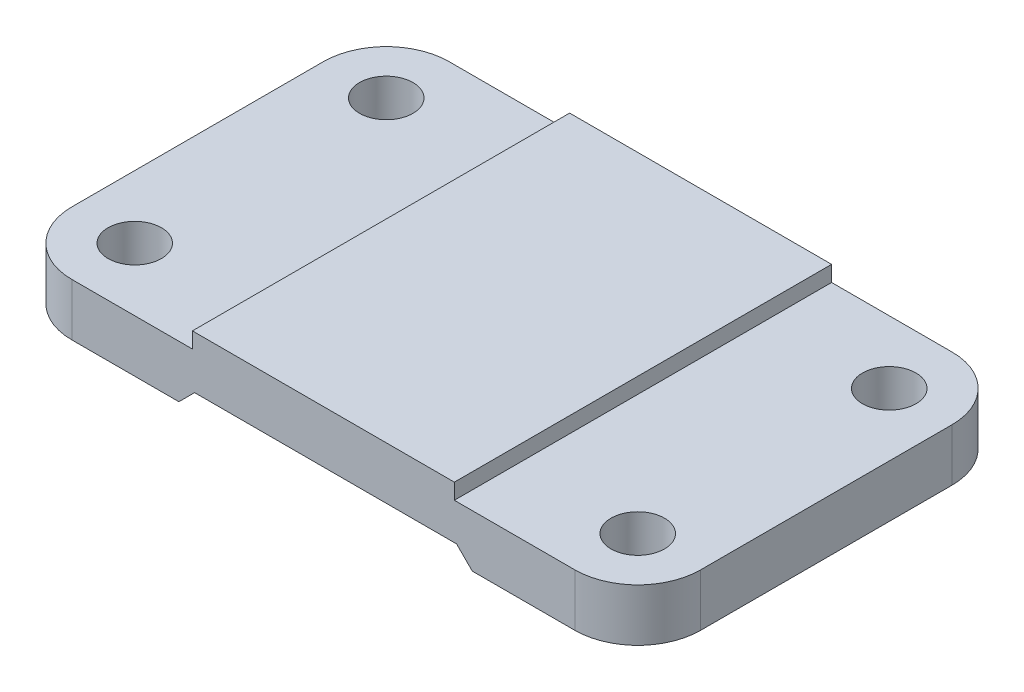
ISO-10303-21;
HEADER;
FILE_DESCRIPTION(('STEP AP214'),'2;1');
FILE_NAME('part.step','',(''),(''),'','','');
FILE_SCHEMA(('AUTOMOTIVE_DESIGN { 1 0 10303 214 1 1 1 1 }'));
ENDSEC;
DATA;
#1=APPLICATION_CONTEXT('core data for automotive mechanical design processes');
#2=APPLICATION_PROTOCOL_DEFINITION('international standard','automotive_design',2000,#1);
#3=PRODUCT_CONTEXT('',#1,'mechanical');
#4=PRODUCT('Part','Part','',(#3));
#5=PRODUCT_RELATED_PRODUCT_CATEGORY('part','',(#4));
#6=PRODUCT_DEFINITION_FORMATION('','',#4);
#7=PRODUCT_DEFINITION_CONTEXT('part definition',#1,'design');
#8=PRODUCT_DEFINITION('design','',#6,#7);
#9=PRODUCT_DEFINITION_SHAPE('','',#8);
#10=(LENGTH_UNIT() NAMED_UNIT(*) SI_UNIT(.MILLI.,.METRE.));
#11=(NAMED_UNIT(*) PLANE_ANGLE_UNIT() SI_UNIT($,.RADIAN.));
#12=(NAMED_UNIT(*) SI_UNIT($,.STERADIAN.) SOLID_ANGLE_UNIT());
#13=UNCERTAINTY_MEASURE_WITH_UNIT(LENGTH_MEASURE(1.E-05),#10,'distance_accuracy_value','');
#14=(GEOMETRIC_REPRESENTATION_CONTEXT(3) GLOBAL_UNCERTAINTY_ASSIGNED_CONTEXT((#13)) GLOBAL_UNIT_ASSIGNED_CONTEXT((#10,
#11,#12)) REPRESENTATION_CONTEXT('',''));
#15=CARTESIAN_POINT('',(0.,0.,0.));
#16=DIRECTION('',(0.,0.,1.));
#17=DIRECTION('',(1.,0.,0.));
#18=AXIS2_PLACEMENT_3D('',#15,#16,#17);
#19=CARTESIAN_POINT('',(32.4207275710564,0.,72.));
#20=DIRECTION('',(0.,1.,0.));
#21=DIRECTION('',(-1.,0.,0.));
#22=AXIS2_PLACEMENT_3D('',#19,#20,#21);
#23=PLANE('',#22);
#24=CARTESIAN_POINT('',(12.,0.,60.));
#25=DIRECTION('',(0.,1.,0.));
#26=DIRECTION('',(-1.,0.,0.));
#27=AXIS2_PLACEMENT_3D('',#24,#25,#26);
#28=CIRCLE('',#27,5.1);
#29=CARTESIAN_POINT('',(6.9,0.,60.));
#30=VERTEX_POINT('',#29);
#31=EDGE_CURVE('E308',#30,#30,#28,.F.);
#32=ORIENTED_EDGE('',*,*,#31,.F.);
#33=EDGE_LOOP('',(#32));
#34=FACE_BOUND('',#33,.T.);
#35=CARTESIAN_POINT('',(12.,0.,12.));
#36=DIRECTION('',(0.,1.,0.));
#37=DIRECTION('',(-1.,0.,0.));
#38=AXIS2_PLACEMENT_3D('',#35,#36,#37);
#39=CIRCLE('',#38,5.1);
#40=CARTESIAN_POINT('',(6.9,0.,12.));
#41=VERTEX_POINT('',#40);
#42=EDGE_CURVE('E305',#41,#41,#39,.F.);
#43=ORIENTED_EDGE('',*,*,#42,.F.);
#44=EDGE_LOOP('',(#43));
#45=FACE_BOUND('',#44,.T.);
#46=DIRECTION('',(0.,0.,-1.));
#47=VECTOR('',#46,1.);
#48=CARTESIAN_POINT('',(0.,0.,72.));
#49=LINE('',#48,#47);
#50=CARTESIAN_POINT('',(0.,0.,60.));
#51=VERTEX_POINT('',#50);
#52=CARTESIAN_POINT('',(0.,0.,12.));
#53=VERTEX_POINT('',#52);
#54=EDGE_CURVE('E257',#51,#53,#49,.T.);
#55=ORIENTED_EDGE('',*,*,#54,.T.);
#56=CARTESIAN_POINT('',(12.,0.,12.));
#57=DIRECTION('',(0.,1.,0.));
#58=DIRECTION('',(-1.,0.,0.));
#59=AXIS2_PLACEMENT_3D('',#56,#57,#58);
#60=CIRCLE('',#59,12.);
#61=CARTESIAN_POINT('',(12.,0.,0.));
#62=VERTEX_POINT('',#61);
#63=EDGE_CURVE('E195',#53,#62,#60,.F.);
#64=ORIENTED_EDGE('',*,*,#63,.T.);
#65=DIRECTION('',(1.,0.,0.));
#66=VECTOR('',#65,1.);
#67=CARTESIAN_POINT('',(32.4207275710564,0.,0.));
#68=LINE('',#67,#66);
#69=CARTESIAN_POINT('',(32.4207275710564,0.,0.));
#70=VERTEX_POINT('',#69);
#71=EDGE_CURVE('E181',#62,#70,#68,.T.);
#72=ORIENTED_EDGE('',*,*,#71,.T.);
#73=DIRECTION('',(0.,0.,-1.));
#74=VECTOR('',#73,1.);
#75=CARTESIAN_POINT('',(32.4207275710564,0.,72.));
#76=LINE('',#75,#74);
#77=CARTESIAN_POINT('',(32.4207275710564,0.,72.));
#78=VERTEX_POINT('',#77);
#79=EDGE_CURVE('E173',#78,#70,#76,.T.);
#80=ORIENTED_EDGE('',*,*,#79,.F.);
#81=DIRECTION('',(1.,0.,0.));
#82=VECTOR('',#81,1.);
#83=CARTESIAN_POINT('',(32.4207275710564,0.,72.));
#84=LINE('',#83,#82);
#85=CARTESIAN_POINT('',(12.,0.,72.));
#86=VERTEX_POINT('',#85);
#87=EDGE_CURVE('E159',#86,#78,#84,.T.);
#88=ORIENTED_EDGE('',*,*,#87,.F.);
#89=CARTESIAN_POINT('',(12.,0.,60.));
#90=DIRECTION('',(0.,1.,0.));
#91=DIRECTION('',(-1.,0.,0.));
#92=AXIS2_PLACEMENT_3D('',#89,#90,#91);
#93=CIRCLE('',#92,12.);
#94=EDGE_CURVE('E193',#86,#51,#93,.F.);
#95=ORIENTED_EDGE('',*,*,#94,.T.);
#96=EDGE_LOOP('',(#55,#64,#72,#80,#88,#95));
#97=FACE_BOUND('',#96,.T.);
#98=ADVANCED_FACE('F44',(#34,#45,#97),#23,.F.);
#99=CARTESIAN_POINT('',(35.4207275710564,2.99999999999999,72.));
#100=DIRECTION('',(-0.707106781186547,0.707106781186548,0.));
#101=DIRECTION('',(-0.707106781186548,-0.707106781186547,0.));
#102=AXIS2_PLACEMENT_3D('',#99,#100,#101);
#103=PLANE('',#102);
#104=DIRECTION('',(0.707106781186548,0.707106781186547,0.));
#105=VECTOR('',#104,1.);
#106=CARTESIAN_POINT('',(35.4207275710564,2.99999999999999,0.));
#107=LINE('',#106,#105);
#108=CARTESIAN_POINT('',(35.4207275710564,2.99999999999999,0.));
#109=VERTEX_POINT('',#108);
#110=EDGE_CURVE('E286',#70,#109,#107,.T.);
#111=ORIENTED_EDGE('',*,*,#110,.T.);
#112=DIRECTION('',(0.,0.,-1.));
#113=VECTOR('',#112,1.);
#114=CARTESIAN_POINT('',(35.4207275710564,2.99999999999999,72.));
#115=LINE('',#114,#113);
#116=CARTESIAN_POINT('',(35.4207275710564,2.99999999999999,72.));
#117=VERTEX_POINT('',#116);
#118=EDGE_CURVE('E175',#117,#109,#115,.T.);
#119=ORIENTED_EDGE('',*,*,#118,.F.);
#120=DIRECTION('',(0.707106781186548,0.707106781186547,0.));
#121=VECTOR('',#120,1.);
#122=CARTESIAN_POINT('',(35.4207275710564,2.99999999999999,72.));
#123=LINE('',#122,#121);
#124=EDGE_CURVE('E162',#78,#117,#123,.T.);
#125=ORIENTED_EDGE('',*,*,#124,.F.);
#126=ORIENTED_EDGE('',*,*,#79,.T.);
#127=EDGE_LOOP('',(#111,#119,#125,#126));
#128=FACE_BOUND('',#127,.T.);
#129=ADVANCED_FACE('F172',(#128),#103,.F.);
#130=CARTESIAN_POINT('',(85.4207275710564,3.,72.));
#131=DIRECTION('',(0.,1.,0.));
#132=DIRECTION('',(-1.,0.,0.));
#133=AXIS2_PLACEMENT_3D('',#130,#131,#132);
#134=PLANE('',#133);
#135=DIRECTION('',(1.,0.,0.));
#136=VECTOR('',#135,1.);
#137=CARTESIAN_POINT('',(85.4207275710564,3.,0.));
#138=LINE('',#137,#136);
#139=CARTESIAN_POINT('',(85.4207275710564,3.,0.));
#140=VERTEX_POINT('',#139);
#141=EDGE_CURVE('E285',#109,#140,#138,.T.);
#142=ORIENTED_EDGE('',*,*,#141,.T.);
#143=DIRECTION('',(0.,0.,-1.));
#144=VECTOR('',#143,1.);
#145=CARTESIAN_POINT('',(85.4207275710564,3.,72.));
#146=LINE('',#145,#144);
#147=CARTESIAN_POINT('',(85.4207275710564,3.,72.));
#148=VERTEX_POINT('',#147);
#149=EDGE_CURVE('E187',#148,#140,#146,.T.);
#150=ORIENTED_EDGE('',*,*,#149,.F.);
#151=DIRECTION('',(1.,0.,0.));
#152=VECTOR('',#151,1.);
#153=CARTESIAN_POINT('',(85.4207275710564,3.,72.));
#154=LINE('',#153,#152);
#155=EDGE_CURVE('E177',#117,#148,#154,.T.);
#156=ORIENTED_EDGE('',*,*,#155,.F.);
#157=ORIENTED_EDGE('',*,*,#118,.T.);
#158=EDGE_LOOP('',(#142,#150,#156,#157));
#159=FACE_BOUND('',#158,.T.);
#160=ADVANCED_FACE('F389',(#159),#134,.F.);
#161=CARTESIAN_POINT('',(88.4207275710564,0.,72.));
#162=DIRECTION('',(0.707106781186547,0.707106781186548,0.));
#163=DIRECTION('',(-0.707106781186548,0.707106781186547,0.));
#164=AXIS2_PLACEMENT_3D('',#161,#162,#163);
#165=PLANE('',#164);
#166=DIRECTION('',(0.707106781186548,-0.707106781186547,0.));
#167=VECTOR('',#166,1.);
#168=CARTESIAN_POINT('',(88.4207275710564,0.,0.));
#169=LINE('',#168,#167);
#170=CARTESIAN_POINT('',(88.4207275710564,0.,0.));
#171=VERTEX_POINT('',#170);
#172=EDGE_CURVE('E248',#140,#171,#169,.T.);
#173=ORIENTED_EDGE('',*,*,#172,.T.);
#174=DIRECTION('',(0.,0.,-1.));
#175=VECTOR('',#174,1.);
#176=CARTESIAN_POINT('',(88.4207275710564,0.,72.));
#177=LINE('',#176,#175);
#178=CARTESIAN_POINT('',(88.4207275710564,0.,72.));
#179=VERTEX_POINT('',#178);
#180=EDGE_CURVE('E230',#179,#171,#177,.T.);
#181=ORIENTED_EDGE('',*,*,#180,.F.);
#182=DIRECTION('',(0.707106781186548,-0.707106781186547,0.));
#183=VECTOR('',#182,1.);
#184=CARTESIAN_POINT('',(88.4207275710564,0.,72.));
#185=LINE('',#184,#183);
#186=EDGE_CURVE('E282',#148,#179,#185,.T.);
#187=ORIENTED_EDGE('',*,*,#186,.F.);
#188=ORIENTED_EDGE('',*,*,#149,.T.);
#189=EDGE_LOOP('',(#173,#181,#187,#188));
#190=FACE_BOUND('',#189,.T.);
#191=ADVANCED_FACE('F280',(#190),#165,.F.);
#192=CARTESIAN_POINT('',(120.,0.,72.));
#193=DIRECTION('',(0.,1.,0.));
#194=DIRECTION('',(-1.,0.,0.));
#195=AXIS2_PLACEMENT_3D('',#192,#193,#194);
#196=PLANE('',#195);
#197=CARTESIAN_POINT('',(108.,0.,12.));
#198=DIRECTION('',(0.,1.,0.));
#199=DIRECTION('',(-1.,0.,0.));
#200=AXIS2_PLACEMENT_3D('',#197,#198,#199);
#201=CIRCLE('',#200,5.09999999999998);
#202=CARTESIAN_POINT('',(102.9,0.,12.));
#203=VERTEX_POINT('',#202);
#204=EDGE_CURVE('E314',#203,#203,#201,.F.);
#205=ORIENTED_EDGE('',*,*,#204,.F.);
#206=EDGE_LOOP('',(#205));
#207=FACE_BOUND('',#206,.T.);
#208=CARTESIAN_POINT('',(108.,0.,60.));
#209=DIRECTION('',(0.,1.,0.));
#210=DIRECTION('',(-1.,0.,0.));
#211=AXIS2_PLACEMENT_3D('',#208,#209,#210);
#212=CIRCLE('',#211,5.09999999999998);
#213=CARTESIAN_POINT('',(102.9,0.,60.));
#214=VERTEX_POINT('',#213);
#215=EDGE_CURVE('E320',#214,#214,#212,.F.);
#216=ORIENTED_EDGE('',*,*,#215,.F.);
#217=EDGE_LOOP('',(#216));
#218=FACE_BOUND('',#217,.T.);
#219=DIRECTION('',(1.,0.,0.));
#220=VECTOR('',#219,1.);
#221=CARTESIAN_POINT('',(120.,0.,0.));
#222=LINE('',#221,#220);
#223=CARTESIAN_POINT('',(108.,0.,0.));
#224=VERTEX_POINT('',#223);
#225=EDGE_CURVE('E222',#171,#224,#222,.T.);
#226=ORIENTED_EDGE('',*,*,#225,.T.);
#227=CARTESIAN_POINT('',(108.,0.,12.));
#228=DIRECTION('',(0.,1.,0.));
#229=DIRECTION('',(-1.,0.,0.));
#230=AXIS2_PLACEMENT_3D('',#227,#228,#229);
#231=CIRCLE('',#230,12.);
#232=CARTESIAN_POINT('',(120.,0.,12.));
#233=VERTEX_POINT('',#232);
#234=EDGE_CURVE('E214',#224,#233,#231,.F.);
#235=ORIENTED_EDGE('',*,*,#234,.T.);
#236=DIRECTION('',(0.,0.,-1.));
#237=VECTOR('',#236,1.);
#238=CARTESIAN_POINT('',(120.,0.,72.));
#239=LINE('',#238,#237);
#240=CARTESIAN_POINT('',(120.,0.,60.));
#241=VERTEX_POINT('',#240);
#242=EDGE_CURVE('E219',#241,#233,#239,.T.);
#243=ORIENTED_EDGE('',*,*,#242,.F.);
#244=CARTESIAN_POINT('',(108.,0.,60.));
#245=DIRECTION('',(0.,1.,0.));
#246=DIRECTION('',(-1.,0.,0.));
#247=AXIS2_PLACEMENT_3D('',#244,#245,#246);
#248=CIRCLE('',#247,12.);
#249=CARTESIAN_POINT('',(108.,0.,72.));
#250=VERTEX_POINT('',#249);
#251=EDGE_CURVE('E59',#241,#250,#248,.F.);
#252=ORIENTED_EDGE('',*,*,#251,.T.);
#253=DIRECTION('',(1.,0.,0.));
#254=VECTOR('',#253,1.);
#255=CARTESIAN_POINT('',(120.,0.,72.));
#256=LINE('',#255,#254);
#257=EDGE_CURVE('E301',#179,#250,#256,.T.);
#258=ORIENTED_EDGE('',*,*,#257,.F.);
#259=ORIENTED_EDGE('',*,*,#180,.T.);
#260=EDGE_LOOP('',(#226,#235,#243,#252,#258,#259));
#261=FACE_BOUND('',#260,.T.);
#262=ADVANCED_FACE('F218',(#207,#218,#261),#196,.F.);
#263=CARTESIAN_POINT('',(120.,10.,72.));
#264=DIRECTION('',(-1.,0.,0.));
#265=DIRECTION('',(0.,0.,1.));
#266=AXIS2_PLACEMENT_3D('',#263,#264,#265);
#267=PLANE('',#266);
#268=ORIENTED_EDGE('',*,*,#242,.T.);
#269=DIRECTION('',(0.,1.,0.));
#270=VECTOR('',#269,1.);
#271=CARTESIAN_POINT('',(120.,10.,12.));
#272=LINE('',#271,#270);
#273=CARTESIAN_POINT('',(120.,10.,12.));
#274=VERTEX_POINT('',#273);
#275=EDGE_CURVE('E207',#233,#274,#272,.T.);
#276=ORIENTED_EDGE('',*,*,#275,.T.);
#277=DIRECTION('',(0.,0.,-1.));
#278=VECTOR('',#277,1.);
#279=CARTESIAN_POINT('',(120.,10.,72.));
#280=LINE('',#279,#278);
#281=CARTESIAN_POINT('',(120.,10.,60.));
#282=VERTEX_POINT('',#281);
#283=EDGE_CURVE('E231',#282,#274,#280,.T.);
#284=ORIENTED_EDGE('',*,*,#283,.F.);
#285=DIRECTION('',(0.,1.,0.));
#286=VECTOR('',#285,1.);
#287=CARTESIAN_POINT('',(120.,10.,60.));
#288=LINE('',#287,#286);
#289=EDGE_CURVE('E205',#282,#241,#288,.F.);
#290=ORIENTED_EDGE('',*,*,#289,.T.);
#291=EDGE_LOOP('',(#268,#276,#284,#290));
#292=FACE_BOUND('',#291,.T.);
#293=ADVANCED_FACE('F227',(#292),#267,.F.);
#294=CARTESIAN_POINT('',(85.,10.,72.));
#295=DIRECTION('',(0.,-1.,0.));
#296=DIRECTION('',(0.,0.,-1.));
#297=AXIS2_PLACEMENT_3D('',#294,#295,#296);
#298=PLANE('',#297);
#299=CARTESIAN_POINT('',(108.,10.,12.));
#300=DIRECTION('',(0.,1.,0.));
#301=DIRECTION('',(0.,0.,-1.));
#302=AXIS2_PLACEMENT_3D('',#299,#300,#301);
#303=CIRCLE('',#302,5.09999999999998);
#304=CARTESIAN_POINT('',(108.,10.,6.90000000000005));
#305=VERTEX_POINT('',#304);
#306=EDGE_CURVE('E311',#305,#305,#303,.T.);
#307=ORIENTED_EDGE('',*,*,#306,.F.);
#308=EDGE_LOOP('',(#307));
#309=FACE_BOUND('',#308,.T.);
#310=CARTESIAN_POINT('',(108.,10.,60.));
#311=DIRECTION('',(0.,1.,0.));
#312=DIRECTION('',(0.,0.,1.));
#313=AXIS2_PLACEMENT_3D('',#310,#311,#312);
#314=CIRCLE('',#313,5.09999999999998);
#315=CARTESIAN_POINT('',(108.,10.,65.1));
#316=VERTEX_POINT('',#315);
#317=EDGE_CURVE('E317',#316,#316,#314,.T.);
#318=ORIENTED_EDGE('',*,*,#317,.F.);
#319=EDGE_LOOP('',(#318));
#320=FACE_BOUND('',#319,.T.);
#321=ORIENTED_EDGE('',*,*,#283,.T.);
#322=CARTESIAN_POINT('',(108.,10.,12.));
#323=DIRECTION('',(0.,-1.,0.));
#324=DIRECTION('',(0.,0.,-1.));
#325=AXIS2_PLACEMENT_3D('',#322,#323,#324);
#326=CIRCLE('',#325,12.);
#327=CARTESIAN_POINT('',(108.,10.,0.));
#328=VERTEX_POINT('',#327);
#329=EDGE_CURVE('E211',#274,#328,#326,.F.);
#330=ORIENTED_EDGE('',*,*,#329,.T.);
#331=DIRECTION('',(-1.,0.,0.));
#332=VECTOR('',#331,1.);
#333=CARTESIAN_POINT('',(85.,10.,0.));
#334=LINE('',#333,#332);
#335=CARTESIAN_POINT('',(85.,10.,0.));
#336=VERTEX_POINT('',#335);
#337=EDGE_CURVE('E238',#328,#336,#334,.T.);
#338=ORIENTED_EDGE('',*,*,#337,.T.);
#339=DIRECTION('',(0.,0.,-1.));
#340=VECTOR('',#339,1.);
#341=CARTESIAN_POINT('',(85.,10.,72.));
#342=LINE('',#341,#340);
#343=CARTESIAN_POINT('',(85.,10.,72.));
#344=VERTEX_POINT('',#343);
#345=EDGE_CURVE('E272',#344,#336,#342,.T.);
#346=ORIENTED_EDGE('',*,*,#345,.F.);
#347=DIRECTION('',(-1.,0.,0.));
#348=VECTOR('',#347,1.);
#349=CARTESIAN_POINT('',(85.,10.,72.));
#350=LINE('',#349,#348);
#351=CARTESIAN_POINT('',(108.,10.,72.));
#352=VERTEX_POINT('',#351);
#353=EDGE_CURVE('E299',#352,#344,#350,.T.);
#354=ORIENTED_EDGE('',*,*,#353,.F.);
#355=CARTESIAN_POINT('',(108.,10.,60.));
#356=DIRECTION('',(0.,-1.,0.));
#357=DIRECTION('',(0.,0.,-1.));
#358=AXIS2_PLACEMENT_3D('',#355,#356,#357);
#359=CIRCLE('',#358,12.);
#360=EDGE_CURVE('E67',#352,#282,#359,.F.);
#361=ORIENTED_EDGE('',*,*,#360,.T.);
#362=EDGE_LOOP('',(#321,#330,#338,#346,#354,#361));
#363=FACE_BOUND('',#362,.T.);
#364=ADVANCED_FACE('F236',(#309,#320,#363),#298,.F.);
#365=CARTESIAN_POINT('',(85.,13.,72.));
#366=DIRECTION('',(-1.,0.,0.));
#367=DIRECTION('',(0.,0.,1.));
#368=AXIS2_PLACEMENT_3D('',#365,#366,#367);
#369=PLANE('',#368);
#370=DIRECTION('',(0.,1.,0.));
#371=VECTOR('',#370,1.);
#372=CARTESIAN_POINT('',(85.,13.,0.));
#373=LINE('',#372,#371);
#374=CARTESIAN_POINT('',(85.,13.,0.));
#375=VERTEX_POINT('',#374);
#376=EDGE_CURVE('E244',#336,#375,#373,.T.);
#377=ORIENTED_EDGE('',*,*,#376,.T.);
#378=DIRECTION('',(0.,0.,-1.));
#379=VECTOR('',#378,1.);
#380=CARTESIAN_POINT('',(85.,13.,72.));
#381=LINE('',#380,#379);
#382=CARTESIAN_POINT('',(85.,13.,72.));
#383=VERTEX_POINT('',#382);
#384=EDGE_CURVE('E269',#383,#375,#381,.T.);
#385=ORIENTED_EDGE('',*,*,#384,.F.);
#386=DIRECTION('',(0.,1.,0.));
#387=VECTOR('',#386,1.);
#388=CARTESIAN_POINT('',(85.,13.,72.));
#389=LINE('',#388,#387);
#390=EDGE_CURVE('E297',#344,#383,#389,.T.);
#391=ORIENTED_EDGE('',*,*,#390,.F.);
#392=ORIENTED_EDGE('',*,*,#345,.T.);
#393=EDGE_LOOP('',(#377,#385,#391,#392));
#394=FACE_BOUND('',#393,.T.);
#395=ADVANCED_FACE('F374',(#394),#369,.F.);
#396=CARTESIAN_POINT('',(35.,13.,72.));
#397=DIRECTION('',(0.,-1.,0.));
#398=DIRECTION('',(0.,0.,-1.));
#399=AXIS2_PLACEMENT_3D('',#396,#397,#398);
#400=PLANE('',#399);
#401=DIRECTION('',(-1.,0.,0.));
#402=VECTOR('',#401,1.);
#403=CARTESIAN_POINT('',(35.,13.,0.));
#404=LINE('',#403,#402);
#405=CARTESIAN_POINT('',(35.,13.,0.));
#406=VERTEX_POINT('',#405);
#407=EDGE_CURVE('E246',#375,#406,#404,.T.);
#408=ORIENTED_EDGE('',*,*,#407,.T.);
#409=DIRECTION('',(0.,0.,-1.));
#410=VECTOR('',#409,1.);
#411=CARTESIAN_POINT('',(35.,13.,72.));
#412=LINE('',#411,#410);
#413=CARTESIAN_POINT('',(35.,13.,72.));
#414=VERTEX_POINT('',#413);
#415=EDGE_CURVE('E266',#414,#406,#412,.T.);
#416=ORIENTED_EDGE('',*,*,#415,.F.);
#417=DIRECTION('',(-1.,0.,0.));
#418=VECTOR('',#417,1.);
#419=CARTESIAN_POINT('',(35.,13.,72.));
#420=LINE('',#419,#418);
#421=EDGE_CURVE('E295',#383,#414,#420,.T.);
#422=ORIENTED_EDGE('',*,*,#421,.F.);
#423=ORIENTED_EDGE('',*,*,#384,.T.);
#424=EDGE_LOOP('',(#408,#416,#422,#423));
#425=FACE_BOUND('',#424,.T.);
#426=ADVANCED_FACE('F370',(#425),#400,.F.);
#427=CARTESIAN_POINT('',(35.,10.,72.));
#428=DIRECTION('',(1.,0.,0.));
#429=DIRECTION('',(0.,0.,-1.));
#430=AXIS2_PLACEMENT_3D('',#427,#428,#429);
#431=PLANE('',#430);
#432=DIRECTION('',(0.,-1.,0.));
#433=VECTOR('',#432,1.);
#434=CARTESIAN_POINT('',(35.,10.,0.));
#435=LINE('',#434,#433);
#436=CARTESIAN_POINT('',(35.,10.,0.));
#437=VERTEX_POINT('',#436);
#438=EDGE_CURVE('E253',#406,#437,#435,.T.);
#439=ORIENTED_EDGE('',*,*,#438,.T.);
#440=DIRECTION('',(0.,0.,-1.));
#441=VECTOR('',#440,1.);
#442=CARTESIAN_POINT('',(35.,10.,72.));
#443=LINE('',#442,#441);
#444=CARTESIAN_POINT('',(35.,10.,72.));
#445=VERTEX_POINT('',#444);
#446=EDGE_CURVE('E263',#445,#437,#443,.T.);
#447=ORIENTED_EDGE('',*,*,#446,.F.);
#448=DIRECTION('',(0.,-1.,0.));
#449=VECTOR('',#448,1.);
#450=CARTESIAN_POINT('',(35.,10.,72.));
#451=LINE('',#450,#449);
#452=EDGE_CURVE('E293',#414,#445,#451,.T.);
#453=ORIENTED_EDGE('',*,*,#452,.F.);
#454=ORIENTED_EDGE('',*,*,#415,.T.);
#455=EDGE_LOOP('',(#439,#447,#453,#454));
#456=FACE_BOUND('',#455,.T.);
#457=ADVANCED_FACE('F347',(#456),#431,.F.);
#458=CARTESIAN_POINT('',(0.,10.,72.));
#459=DIRECTION('',(0.,-1.,0.));
#460=DIRECTION('',(0.,0.,-1.));
#461=AXIS2_PLACEMENT_3D('',#458,#459,#460);
#462=PLANE('',#461);
#463=CARTESIAN_POINT('',(12.,10.,60.));
#464=DIRECTION('',(0.,1.,0.));
#465=DIRECTION('',(0.,0.,-1.));
#466=AXIS2_PLACEMENT_3D('',#463,#464,#465);
#467=CIRCLE('',#466,5.1);
#468=CARTESIAN_POINT('',(12.,10.,54.9));
#469=VERTEX_POINT('',#468);
#470=EDGE_CURVE('E323',#469,#469,#467,.T.);
#471=ORIENTED_EDGE('',*,*,#470,.F.);
#472=EDGE_LOOP('',(#471));
#473=FACE_BOUND('',#472,.T.);
#474=CARTESIAN_POINT('',(12.,10.,12.));
#475=DIRECTION('',(0.,1.,0.));
#476=DIRECTION('',(0.,0.,1.));
#477=AXIS2_PLACEMENT_3D('',#474,#475,#476);
#478=CIRCLE('',#477,5.1);
#479=CARTESIAN_POINT('',(12.,10.,17.1));
#480=VERTEX_POINT('',#479);
#481=EDGE_CURVE('E291',#480,#480,#478,.T.);
#482=ORIENTED_EDGE('',*,*,#481,.F.);
#483=EDGE_LOOP('',(#482));
#484=FACE_BOUND('',#483,.T.);
#485=DIRECTION('',(-1.,0.,0.));
#486=VECTOR('',#485,1.);
#487=CARTESIAN_POINT('',(0.,10.,0.));
#488=LINE('',#487,#486);
#489=CARTESIAN_POINT('',(12.,10.,0.));
#490=VERTEX_POINT('',#489);
#491=EDGE_CURVE('E168',#437,#490,#488,.T.);
#492=ORIENTED_EDGE('',*,*,#491,.T.);
#493=CARTESIAN_POINT('',(12.,10.,12.));
#494=DIRECTION('',(0.,-1.,0.));
#495=DIRECTION('',(0.,0.,-1.));
#496=AXIS2_PLACEMENT_3D('',#493,#494,#495);
#497=CIRCLE('',#496,12.);
#498=CARTESIAN_POINT('',(0.,10.,12.));
#499=VERTEX_POINT('',#498);
#500=EDGE_CURVE('E203',#490,#499,#497,.F.);
#501=ORIENTED_EDGE('',*,*,#500,.T.);
#502=DIRECTION('',(0.,0.,-1.));
#503=VECTOR('',#502,1.);
#504=CARTESIAN_POINT('',(0.,10.,72.));
#505=LINE('',#504,#503);
#506=CARTESIAN_POINT('',(0.,10.,60.));
#507=VERTEX_POINT('',#506);
#508=EDGE_CURVE('E259',#507,#499,#505,.T.);
#509=ORIENTED_EDGE('',*,*,#508,.F.);
#510=CARTESIAN_POINT('',(12.,10.,60.));
#511=DIRECTION('',(0.,-1.,0.));
#512=DIRECTION('',(0.,0.,-1.));
#513=AXIS2_PLACEMENT_3D('',#510,#511,#512);
#514=CIRCLE('',#513,12.);
#515=CARTESIAN_POINT('',(12.,10.,72.));
#516=VERTEX_POINT('',#515);
#517=EDGE_CURVE('E201',#507,#516,#514,.F.);
#518=ORIENTED_EDGE('',*,*,#517,.T.);
#519=DIRECTION('',(-1.,0.,0.));
#520=VECTOR('',#519,1.);
#521=CARTESIAN_POINT('',(0.,10.,72.));
#522=LINE('',#521,#520);
#523=EDGE_CURVE('E260',#445,#516,#522,.T.);
#524=ORIENTED_EDGE('',*,*,#523,.F.);
#525=ORIENTED_EDGE('',*,*,#446,.T.);
#526=EDGE_LOOP('',(#492,#501,#509,#518,#524,#525));
#527=FACE_BOUND('',#526,.T.);
#528=ADVANCED_FACE('F343',(#473,#484,#527),#462,.F.);
#529=CARTESIAN_POINT('',(0.,0.,72.));
#530=DIRECTION('',(1.,0.,0.));
#531=DIRECTION('',(0.,0.,-1.));
#532=AXIS2_PLACEMENT_3D('',#529,#530,#531);
#533=PLANE('',#532);
#534=ORIENTED_EDGE('',*,*,#508,.T.);
#535=DIRECTION('',(0.,-1.,0.));
#536=VECTOR('',#535,1.);
#537=CARTESIAN_POINT('',(0.,0.,12.));
#538=LINE('',#537,#536);
#539=EDGE_CURVE('E185',#499,#53,#538,.T.);
#540=ORIENTED_EDGE('',*,*,#539,.T.);
#541=ORIENTED_EDGE('',*,*,#54,.F.);
#542=DIRECTION('',(0.,-1.,0.));
#543=VECTOR('',#542,1.);
#544=CARTESIAN_POINT('',(0.,0.,60.));
#545=LINE('',#544,#543);
#546=EDGE_CURVE('E183',#51,#507,#545,.F.);
#547=ORIENTED_EDGE('',*,*,#546,.T.);
#548=EDGE_LOOP('',(#534,#540,#541,#547));
#549=FACE_BOUND('',#548,.T.);
#550=ADVANCED_FACE('F346',(#549),#533,.F.);
#551=CARTESIAN_POINT('',(0.,0.,72.));
#552=DIRECTION('',(0.,0.,-1.));
#553=DIRECTION('',(-1.,0.,0.));
#554=AXIS2_PLACEMENT_3D('',#551,#552,#553);
#555=PLANE('',#554);
#556=ORIENTED_EDGE('',*,*,#257,.T.);
#557=DIRECTION('',(0.,1.,0.));
#558=VECTOR('',#557,1.);
#559=CARTESIAN_POINT('',(108.,0.,72.));
#560=LINE('',#559,#558);
#561=EDGE_CURVE('E11',#250,#352,#560,.T.);
#562=ORIENTED_EDGE('',*,*,#561,.T.);
#563=ORIENTED_EDGE('',*,*,#353,.T.);
#564=ORIENTED_EDGE('',*,*,#390,.T.);
#565=ORIENTED_EDGE('',*,*,#421,.T.);
#566=ORIENTED_EDGE('',*,*,#452,.T.);
#567=ORIENTED_EDGE('',*,*,#523,.T.);
#568=DIRECTION('',(0.,-1.,0.));
#569=VECTOR('',#568,1.);
#570=CARTESIAN_POINT('',(12.,0.,72.));
#571=LINE('',#570,#569);
#572=EDGE_CURVE('E52',#516,#86,#571,.T.);
#573=ORIENTED_EDGE('',*,*,#572,.T.);
#574=ORIENTED_EDGE('',*,*,#87,.T.);
#575=ORIENTED_EDGE('',*,*,#124,.T.);
#576=ORIENTED_EDGE('',*,*,#155,.T.);
#577=ORIENTED_EDGE('',*,*,#186,.T.);
#578=EDGE_LOOP('',(#556,#562,#563,#564,#565,#566,#567,#573,#574,#575,#576,#577));
#579=FACE_BOUND('',#578,.T.);
#580=ADVANCED_FACE('F161',(#579),#555,.F.);
#581=CARTESIAN_POINT('',(0.,0.,0.));
#582=DIRECTION('',(0.,0.,-1.));
#583=DIRECTION('',(-1.,0.,0.));
#584=AXIS2_PLACEMENT_3D('',#581,#582,#583);
#585=PLANE('',#584);
#586=ORIENTED_EDGE('',*,*,#71,.F.);
#587=DIRECTION('',(0.,-1.,0.));
#588=VECTOR('',#587,1.);
#589=CARTESIAN_POINT('',(12.,10.,0.));
#590=LINE('',#589,#588);
#591=EDGE_CURVE('E199',#62,#490,#590,.F.);
#592=ORIENTED_EDGE('',*,*,#591,.T.);
#593=ORIENTED_EDGE('',*,*,#491,.F.);
#594=ORIENTED_EDGE('',*,*,#438,.F.);
#595=ORIENTED_EDGE('',*,*,#407,.F.);
#596=ORIENTED_EDGE('',*,*,#376,.F.);
#597=ORIENTED_EDGE('',*,*,#337,.F.);
#598=DIRECTION('',(0.,1.,0.));
#599=VECTOR('',#598,1.);
#600=CARTESIAN_POINT('',(108.,0.,0.));
#601=LINE('',#600,#599);
#602=EDGE_CURVE('E197',#328,#224,#601,.F.);
#603=ORIENTED_EDGE('',*,*,#602,.T.);
#604=ORIENTED_EDGE('',*,*,#225,.F.);
#605=ORIENTED_EDGE('',*,*,#172,.F.);
#606=ORIENTED_EDGE('',*,*,#141,.F.);
#607=ORIENTED_EDGE('',*,*,#110,.F.);
#608=EDGE_LOOP('',(#586,#592,#593,#594,#595,#596,#597,#603,#604,#605,#606,#607));
#609=FACE_BOUND('',#608,.T.);
#610=ADVANCED_FACE('F242',(#609),#585,.T.);
#611=CARTESIAN_POINT('',(12.,-0.00200000000000027,12.));
#612=DIRECTION('',(0.,1.,0.));
#613=DIRECTION('',(0.,0.,1.));
#614=AXIS2_PLACEMENT_3D('',#611,#612,#613);
#615=CYLINDRICAL_SURFACE('',#614,5.1);
#616=ORIENTED_EDGE('',*,*,#42,.T.);
#617=EDGE_LOOP('',(#616));
#618=FACE_BOUND('',#617,.T.);
#619=ORIENTED_EDGE('',*,*,#481,.T.);
#620=EDGE_LOOP('',(#619));
#621=FACE_BOUND('',#620,.T.);
#622=ADVANCED_FACE('F337',(#618,#621),#615,.F.);
#623=CARTESIAN_POINT('',(12.,-0.00200000000000027,60.));
#624=DIRECTION('',(0.,1.,0.));
#625=DIRECTION('',(0.,0.,1.));
#626=AXIS2_PLACEMENT_3D('',#623,#624,#625);
#627=CYLINDRICAL_SURFACE('',#626,5.1);
#628=ORIENTED_EDGE('',*,*,#31,.T.);
#629=EDGE_LOOP('',(#628));
#630=FACE_BOUND('',#629,.T.);
#631=ORIENTED_EDGE('',*,*,#470,.T.);
#632=EDGE_LOOP('',(#631));
#633=FACE_BOUND('',#632,.T.);
#634=ADVANCED_FACE('F329',(#630,#633),#627,.F.);
#635=CARTESIAN_POINT('',(108.,-0.00200000000000027,60.));
#636=DIRECTION('',(0.,1.,0.));
#637=DIRECTION('',(0.,0.,1.));
#638=AXIS2_PLACEMENT_3D('',#635,#636,#637);
#639=CYLINDRICAL_SURFACE('',#638,5.09999999999998);
#640=ORIENTED_EDGE('',*,*,#215,.T.);
#641=EDGE_LOOP('',(#640));
#642=FACE_BOUND('',#641,.T.);
#643=ORIENTED_EDGE('',*,*,#317,.T.);
#644=EDGE_LOOP('',(#643));
#645=FACE_BOUND('',#644,.T.);
#646=ADVANCED_FACE('F416',(#642,#645),#639,.F.);
#647=CARTESIAN_POINT('',(108.,-0.00200000000000027,12.));
#648=DIRECTION('',(0.,1.,0.));
#649=DIRECTION('',(0.,0.,1.));
#650=AXIS2_PLACEMENT_3D('',#647,#648,#649);
#651=CYLINDRICAL_SURFACE('',#650,5.09999999999998);
#652=ORIENTED_EDGE('',*,*,#204,.T.);
#653=EDGE_LOOP('',(#652));
#654=FACE_BOUND('',#653,.T.);
#655=ORIENTED_EDGE('',*,*,#306,.T.);
#656=EDGE_LOOP('',(#655));
#657=FACE_BOUND('',#656,.T.);
#658=ADVANCED_FACE('F385',(#654,#657),#651,.F.);
#659=CARTESIAN_POINT('',(12.,0.,12.));
#660=DIRECTION('',(0.,1.,0.));
#661=DIRECTION('',(0.,0.,1.));
#662=AXIS2_PLACEMENT_3D('',#659,#660,#661);
#663=CYLINDRICAL_SURFACE('',#662,12.);
#664=ORIENTED_EDGE('',*,*,#500,.F.);
#665=ORIENTED_EDGE('',*,*,#591,.F.);
#666=ORIENTED_EDGE('',*,*,#63,.F.);
#667=ORIENTED_EDGE('',*,*,#539,.F.);
#668=EDGE_LOOP('',(#664,#665,#666,#667));
#669=FACE_BOUND('',#668,.T.);
#670=ADVANCED_FACE('F359',(#669),#663,.T.);
#671=CARTESIAN_POINT('',(108.,10.,12.));
#672=DIRECTION('',(0.,-1.,0.));
#673=DIRECTION('',(0.,0.,-1.));
#674=AXIS2_PLACEMENT_3D('',#671,#672,#673);
#675=CYLINDRICAL_SURFACE('',#674,12.);
#676=ORIENTED_EDGE('',*,*,#234,.F.);
#677=ORIENTED_EDGE('',*,*,#602,.F.);
#678=ORIENTED_EDGE('',*,*,#329,.F.);
#679=ORIENTED_EDGE('',*,*,#275,.F.);
#680=EDGE_LOOP('',(#676,#677,#678,#679));
#681=FACE_BOUND('',#680,.T.);
#682=ADVANCED_FACE('F233',(#681),#675,.T.);
#683=CARTESIAN_POINT('',(108.,0.,60.));
#684=DIRECTION('',(0.,1.,0.));
#685=DIRECTION('',(0.,0.,1.));
#686=AXIS2_PLACEMENT_3D('',#683,#684,#685);
#687=CYLINDRICAL_SURFACE('',#686,12.);
#688=ORIENTED_EDGE('',*,*,#251,.F.);
#689=ORIENTED_EDGE('',*,*,#289,.F.);
#690=ORIENTED_EDGE('',*,*,#360,.F.);
#691=ORIENTED_EDGE('',*,*,#561,.F.);
#692=EDGE_LOOP('',(#688,#689,#690,#691));
#693=FACE_BOUND('',#692,.T.);
#694=ADVANCED_FACE('F376',(#693),#687,.T.);
#695=CARTESIAN_POINT('',(12.,0.,60.));
#696=DIRECTION('',(0.,-1.,0.));
#697=DIRECTION('',(0.,0.,-1.));
#698=AXIS2_PLACEMENT_3D('',#695,#696,#697);
#699=CYLINDRICAL_SURFACE('',#698,12.);
#700=ORIENTED_EDGE('',*,*,#517,.F.);
#701=ORIENTED_EDGE('',*,*,#546,.F.);
#702=ORIENTED_EDGE('',*,*,#94,.F.);
#703=ORIENTED_EDGE('',*,*,#572,.F.);
#704=EDGE_LOOP('',(#700,#701,#702,#703));
#705=FACE_BOUND('',#704,.T.);
#706=ADVANCED_FACE('F46',(#705),#699,.T.);
#707=CLOSED_SHELL('',(#98,#129,#160,#191,#262,#293,#364,#395,#426,#457,#528,#550,#580,#610,#622,
#634,#646,#658,#670,#682,#694,#706));
#708=MANIFOLD_SOLID_BREP('B2',#707);
#709=ADVANCED_BREP_SHAPE_REPRESENTATION('',(#18,#708),#14);
#710=SHAPE_DEFINITION_REPRESENTATION(#9,#709);
ENDSEC;
END-ISO-10303-21;
